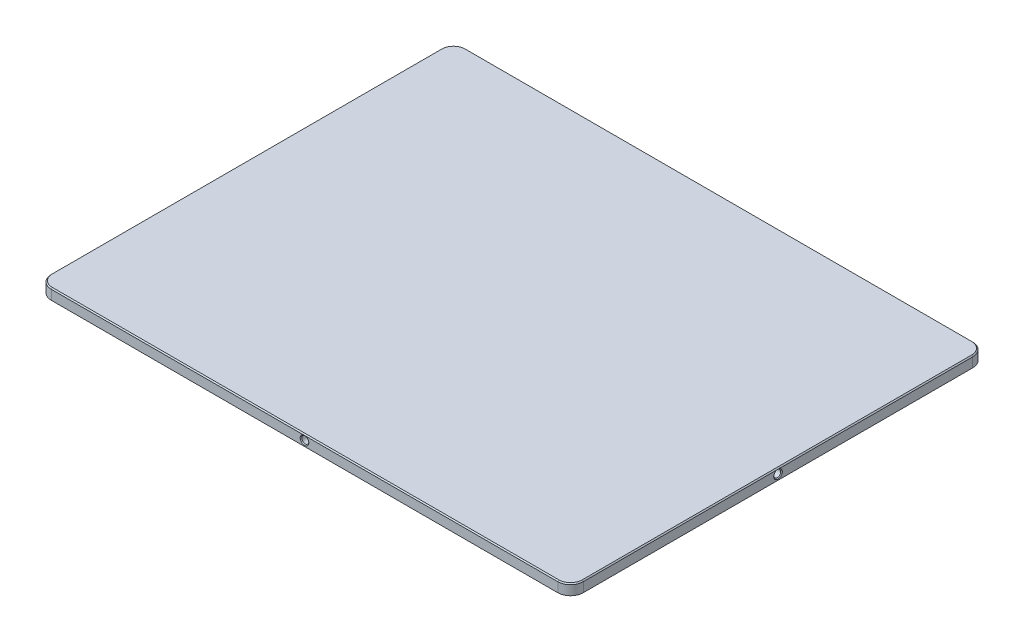
ISO-10303-21;
HEADER;
FILE_DESCRIPTION(('STEP AP214'),'2;1');
FILE_NAME('part.step','',(''),(''),'','','');
FILE_SCHEMA(('AUTOMOTIVE_DESIGN { 1 0 10303 214 1 1 1 1 }'));
ENDSEC;
DATA;
#1=APPLICATION_CONTEXT('core data for automotive mechanical design processes');
#2=APPLICATION_PROTOCOL_DEFINITION('international standard','automotive_design',2000,#1);
#3=PRODUCT_CONTEXT('',#1,'mechanical');
#4=PRODUCT('Part','Part','',(#3));
#5=PRODUCT_RELATED_PRODUCT_CATEGORY('part','',(#4));
#6=PRODUCT_DEFINITION_FORMATION('','',#4);
#7=PRODUCT_DEFINITION_CONTEXT('part definition',#1,'design');
#8=PRODUCT_DEFINITION('design','',#6,#7);
#9=PRODUCT_DEFINITION_SHAPE('','',#8);
#10=(LENGTH_UNIT() NAMED_UNIT(*) SI_UNIT(.MILLI.,.METRE.));
#11=(NAMED_UNIT(*) PLANE_ANGLE_UNIT() SI_UNIT($,.RADIAN.));
#12=(NAMED_UNIT(*) SI_UNIT($,.STERADIAN.) SOLID_ANGLE_UNIT());
#13=UNCERTAINTY_MEASURE_WITH_UNIT(LENGTH_MEASURE(1.E-05),#10,'distance_accuracy_value','');
#14=(GEOMETRIC_REPRESENTATION_CONTEXT(3) GLOBAL_UNCERTAINTY_ASSIGNED_CONTEXT((#13)) GLOBAL_UNIT_ASSIGNED_CONTEXT((#10,
#11,#12)) REPRESENTATION_CONTEXT('',''));
#15=CARTESIAN_POINT('',(0.,0.,0.));
#16=DIRECTION('',(0.,0.,1.));
#17=DIRECTION('',(1.,0.,0.));
#18=AXIS2_PLACEMENT_3D('',#15,#16,#17);
#19=CARTESIAN_POINT('',(125.,5.,-97.5));
#20=DIRECTION('',(-1.,0.,0.));
#21=DIRECTION('',(0.,0.,1.));
#22=AXIS2_PLACEMENT_3D('',#19,#20,#21);
#23=PLANE('',#22);
#24=DIRECTION('',(0.,-1.,0.));
#25=VECTOR('',#24,1.);
#26=CARTESIAN_POINT('',(125.,5.,-91.5));
#27=LINE('',#26,#25);
#28=CARTESIAN_POINT('',(125.,0.,-91.5));
#29=VERTEX_POINT('',#28);
#30=CARTESIAN_POINT('',(125.,4.5,-91.5));
#31=VERTEX_POINT('',#30);
#32=EDGE_CURVE('E214',#29,#31,#27,.F.);
#33=ORIENTED_EDGE('',*,*,#32,.T.);
#34=DIRECTION('',(0.,0.,1.));
#35=VECTOR('',#34,1.);
#36=CARTESIAN_POINT('',(125.,4.5,91.5));
#37=LINE('',#36,#35);
#38=CARTESIAN_POINT('',(125.,4.5,-0.317214438511259));
#39=VERTEX_POINT('',#38);
#40=EDGE_CURVE('E248',#31,#39,#37,.T.);
#41=ORIENTED_EDGE('',*,*,#40,.T.);
#42=CARTESIAN_POINT('',(125.,2.5,0.));
#43=DIRECTION('',(1.,0.,0.));
#44=DIRECTION('',(0.,0.,-1.));
#45=AXIS2_PLACEMENT_3D('',#42,#43,#44);
#46=CIRCLE('',#45,2.025);
#47=CARTESIAN_POINT('',(125.,4.5,0.317214438511259));
#48=VERTEX_POINT('',#47);
#49=EDGE_CURVE('E178',#48,#39,#46,.T.);
#50=ORIENTED_EDGE('',*,*,#49,.F.);
#51=DIRECTION('',(0.,0.,1.));
#52=VECTOR('',#51,1.);
#53=CARTESIAN_POINT('',(125.,4.5,91.5));
#54=LINE('',#53,#52);
#55=CARTESIAN_POINT('',(125.,4.5,91.5));
#56=VERTEX_POINT('',#55);
#57=EDGE_CURVE('E246',#48,#56,#54,.T.);
#58=ORIENTED_EDGE('',*,*,#57,.T.);
#59=DIRECTION('',(0.,-1.,0.));
#60=VECTOR('',#59,1.);
#61=CARTESIAN_POINT('',(125.,5.,91.5));
#62=LINE('',#61,#60);
#63=CARTESIAN_POINT('',(125.,0.,91.5));
#64=VERTEX_POINT('',#63);
#65=EDGE_CURVE('E212',#56,#64,#62,.T.);
#66=ORIENTED_EDGE('',*,*,#65,.T.);
#67=DIRECTION('',(0.,0.,-1.));
#68=VECTOR('',#67,1.);
#69=CARTESIAN_POINT('',(125.,0.,-97.5));
#70=LINE('',#69,#68);
#71=EDGE_CURVE('E187',#64,#29,#70,.T.);
#72=ORIENTED_EDGE('',*,*,#71,.T.);
#73=EDGE_LOOP('',(#33,#41,#50,#58,#66,#72));
#74=FACE_BOUND('',#73,.T.);
#75=ADVANCED_FACE('F38',(#74),#23,.F.);
#76=CARTESIAN_POINT('',(-125.,5.,-97.5));
#77=DIRECTION('',(0.,0.,1.));
#78=DIRECTION('',(1.,0.,0.));
#79=AXIS2_PLACEMENT_3D('',#76,#77,#78);
#80=PLANE('',#79);
#81=DIRECTION('',(0.,-1.,0.));
#82=VECTOR('',#81,1.);
#83=CARTESIAN_POINT('',(-119.,5.,-97.5));
#84=LINE('',#83,#82);
#85=CARTESIAN_POINT('',(-119.,0.,-97.5));
#86=VERTEX_POINT('',#85);
#87=CARTESIAN_POINT('',(-119.,4.5,-97.5));
#88=VERTEX_POINT('',#87);
#89=EDGE_CURVE('E199',#86,#88,#84,.F.);
#90=ORIENTED_EDGE('',*,*,#89,.T.);
#91=DIRECTION('',(1.,0.,0.));
#92=VECTOR('',#91,1.);
#93=CARTESIAN_POINT('',(119.,4.5,-97.5));
#94=LINE('',#93,#92);
#95=CARTESIAN_POINT('',(119.,4.5,-97.5));
#96=VERTEX_POINT('',#95);
#97=EDGE_CURVE('E356',#88,#96,#94,.T.);
#98=ORIENTED_EDGE('',*,*,#97,.T.);
#99=DIRECTION('',(0.,-1.,0.));
#100=VECTOR('',#99,1.);
#101=CARTESIAN_POINT('',(119.,5.,-97.5));
#102=LINE('',#101,#100);
#103=CARTESIAN_POINT('',(119.,0.,-97.5));
#104=VERTEX_POINT('',#103);
#105=EDGE_CURVE('E202',#96,#104,#102,.T.);
#106=ORIENTED_EDGE('',*,*,#105,.T.);
#107=DIRECTION('',(-1.,0.,0.));
#108=VECTOR('',#107,1.);
#109=CARTESIAN_POINT('',(-125.,0.,-97.5));
#110=LINE('',#109,#108);
#111=EDGE_CURVE('E190',#104,#86,#110,.T.);
#112=ORIENTED_EDGE('',*,*,#111,.T.);
#113=EDGE_LOOP('',(#90,#98,#106,#112));
#114=FACE_BOUND('',#113,.T.);
#115=ADVANCED_FACE('F294',(#114),#80,.F.);
#116=CARTESIAN_POINT('',(-125.,5.,-97.5));
#117=DIRECTION('',(1.,0.,0.));
#118=DIRECTION('',(0.,0.,-1.));
#119=AXIS2_PLACEMENT_3D('',#116,#117,#118);
#120=PLANE('',#119);
#121=DIRECTION('',(0.,-1.,0.));
#122=VECTOR('',#121,1.);
#123=CARTESIAN_POINT('',(-125.,5.,91.5));
#124=LINE('',#123,#122);
#125=CARTESIAN_POINT('',(-125.,0.,91.5));
#126=VERTEX_POINT('',#125);
#127=CARTESIAN_POINT('',(-125.,4.5,91.5));
#128=VERTEX_POINT('',#127);
#129=EDGE_CURVE('E217',#126,#128,#124,.F.);
#130=ORIENTED_EDGE('',*,*,#129,.T.);
#131=DIRECTION('',(0.,0.,-1.));
#132=VECTOR('',#131,1.);
#133=CARTESIAN_POINT('',(-125.,4.5,-91.5));
#134=LINE('',#133,#132);
#135=CARTESIAN_POINT('',(-125.,4.5,0.317214438511239));
#136=VERTEX_POINT('',#135);
#137=EDGE_CURVE('E363',#128,#136,#134,.T.);
#138=ORIENTED_EDGE('',*,*,#137,.T.);
#139=CARTESIAN_POINT('',(-125.,2.49999999999999,0.));
#140=DIRECTION('',(-1.,0.,0.));
#141=DIRECTION('',(0.,0.,1.));
#142=AXIS2_PLACEMENT_3D('',#139,#140,#141);
#143=CIRCLE('',#142,2.025);
#144=CARTESIAN_POINT('',(-125.,4.5,-0.317214438511169));
#145=VERTEX_POINT('',#144);
#146=EDGE_CURVE('E162',#145,#136,#143,.T.);
#147=ORIENTED_EDGE('',*,*,#146,.F.);
#148=DIRECTION('',(0.,0.,-1.));
#149=VECTOR('',#148,1.);
#150=CARTESIAN_POINT('',(-125.,4.5,-91.5));
#151=LINE('',#150,#149);
#152=CARTESIAN_POINT('',(-125.,4.5,-91.5));
#153=VERTEX_POINT('',#152);
#154=EDGE_CURVE('E359',#145,#153,#151,.T.);
#155=ORIENTED_EDGE('',*,*,#154,.T.);
#156=DIRECTION('',(0.,-1.,0.));
#157=VECTOR('',#156,1.);
#158=CARTESIAN_POINT('',(-125.,5.,-91.5));
#159=LINE('',#158,#157);
#160=CARTESIAN_POINT('',(-125.,0.,-91.5));
#161=VERTEX_POINT('',#160);
#162=EDGE_CURVE('E220',#153,#161,#159,.T.);
#163=ORIENTED_EDGE('',*,*,#162,.T.);
#164=DIRECTION('',(0.,0.,1.));
#165=VECTOR('',#164,1.);
#166=CARTESIAN_POINT('',(-125.,0.,-97.5));
#167=LINE('',#166,#165);
#168=EDGE_CURVE('E193',#161,#126,#167,.T.);
#169=ORIENTED_EDGE('',*,*,#168,.T.);
#170=EDGE_LOOP('',(#130,#138,#147,#155,#163,#169));
#171=FACE_BOUND('',#170,.T.);
#172=ADVANCED_FACE('F291',(#171),#120,.F.);
#173=CARTESIAN_POINT('',(-125.,5.,97.5));
#174=DIRECTION('',(0.,0.,-1.));
#175=DIRECTION('',(-1.,0.,0.));
#176=AXIS2_PLACEMENT_3D('',#173,#174,#175);
#177=PLANE('',#176);
#178=DIRECTION('',(0.,-1.,0.));
#179=VECTOR('',#178,1.);
#180=CARTESIAN_POINT('',(119.,5.,97.5));
#181=LINE('',#180,#179);
#182=CARTESIAN_POINT('',(119.,0.,97.5));
#183=VERTEX_POINT('',#182);
#184=CARTESIAN_POINT('',(119.,4.5,97.5));
#185=VERTEX_POINT('',#184);
#186=EDGE_CURVE('E224',#183,#185,#181,.F.);
#187=ORIENTED_EDGE('',*,*,#186,.T.);
#188=DIRECTION('',(-1.,0.,0.));
#189=VECTOR('',#188,1.);
#190=CARTESIAN_POINT('',(-119.,4.5,97.5));
#191=LINE('',#190,#189);
#192=CARTESIAN_POINT('',(0.31721443851128,4.5,97.5));
#193=VERTEX_POINT('',#192);
#194=EDGE_CURVE('E47',#185,#193,#191,.T.);
#195=ORIENTED_EDGE('',*,*,#194,.T.);
#196=CARTESIAN_POINT('',(0.,2.5,97.5));
#197=DIRECTION('',(0.,0.,1.));
#198=DIRECTION('',(1.,0.,0.));
#199=AXIS2_PLACEMENT_3D('',#196,#197,#198);
#200=CIRCLE('',#199,2.025);
#201=CARTESIAN_POINT('',(-0.31721443851128,4.5,97.5));
#202=VERTEX_POINT('',#201);
#203=EDGE_CURVE('E169',#202,#193,#200,.T.);
#204=ORIENTED_EDGE('',*,*,#203,.F.);
#205=DIRECTION('',(-1.,0.,0.));
#206=VECTOR('',#205,1.);
#207=CARTESIAN_POINT('',(-119.,4.5,97.5));
#208=LINE('',#207,#206);
#209=CARTESIAN_POINT('',(-119.,4.5,97.5));
#210=VERTEX_POINT('',#209);
#211=EDGE_CURVE('E337',#202,#210,#208,.T.);
#212=ORIENTED_EDGE('',*,*,#211,.T.);
#213=DIRECTION('',(0.,-1.,0.));
#214=VECTOR('',#213,1.);
#215=CARTESIAN_POINT('',(-119.,5.,97.5));
#216=LINE('',#215,#214);
#217=CARTESIAN_POINT('',(-119.,0.,97.5));
#218=VERTEX_POINT('',#217);
#219=EDGE_CURVE('E222',#210,#218,#216,.T.);
#220=ORIENTED_EDGE('',*,*,#219,.T.);
#221=DIRECTION('',(1.,0.,0.));
#222=VECTOR('',#221,1.);
#223=CARTESIAN_POINT('',(-125.,0.,97.5));
#224=LINE('',#223,#222);
#225=EDGE_CURVE('E196',#218,#183,#224,.T.);
#226=ORIENTED_EDGE('',*,*,#225,.T.);
#227=EDGE_LOOP('',(#187,#195,#204,#212,#220,#226));
#228=FACE_BOUND('',#227,.T.);
#229=ADVANCED_FACE('F284',(#228),#177,.F.);
#230=CARTESIAN_POINT('',(0.,5.,0.));
#231=DIRECTION('',(0.,1.,0.));
#232=DIRECTION('',(0.,0.,1.));
#233=AXIS2_PLACEMENT_3D('',#230,#231,#232);
#234=PLANE('',#233);
#235=DIRECTION('',(1.,0.,0.));
#236=VECTOR('',#235,1.);
#237=CARTESIAN_POINT('',(119.,5.,97.));
#238=LINE('',#237,#236);
#239=CARTESIAN_POINT('',(-119.,5.,97.));
#240=VERTEX_POINT('',#239);
#241=CARTESIAN_POINT('',(119.,5.,97.));
#242=VERTEX_POINT('',#241);
#243=EDGE_CURVE('E226',#240,#242,#238,.T.);
#244=ORIENTED_EDGE('',*,*,#243,.T.);
#245=CARTESIAN_POINT('',(119.,5.,91.5));
#246=DIRECTION('',(0.,1.,0.));
#247=DIRECTION('',(0.,0.,1.));
#248=AXIS2_PLACEMENT_3D('',#245,#246,#247);
#249=CIRCLE('',#248,5.49999999999999);
#250=CARTESIAN_POINT('',(124.5,5.,91.5));
#251=VERTEX_POINT('',#250);
#252=EDGE_CURVE('E240',#242,#251,#249,.T.);
#253=ORIENTED_EDGE('',*,*,#252,.T.);
#254=DIRECTION('',(0.,0.,-1.));
#255=VECTOR('',#254,1.);
#256=CARTESIAN_POINT('',(124.5,5.,-91.5));
#257=LINE('',#256,#255);
#258=CARTESIAN_POINT('',(124.5,5.,-91.5));
#259=VERTEX_POINT('',#258);
#260=EDGE_CURVE('E238',#251,#259,#257,.T.);
#261=ORIENTED_EDGE('',*,*,#260,.T.);
#262=CARTESIAN_POINT('',(119.,5.,-91.5));
#263=DIRECTION('',(0.,1.,0.));
#264=DIRECTION('',(0.,0.,1.));
#265=AXIS2_PLACEMENT_3D('',#262,#263,#264);
#266=CIRCLE('',#265,5.49999999999999);
#267=CARTESIAN_POINT('',(119.,5.,-97.));
#268=VERTEX_POINT('',#267);
#269=EDGE_CURVE('E236',#259,#268,#266,.T.);
#270=ORIENTED_EDGE('',*,*,#269,.T.);
#271=DIRECTION('',(-1.,0.,0.));
#272=VECTOR('',#271,1.);
#273=CARTESIAN_POINT('',(-119.,5.,-97.));
#274=LINE('',#273,#272);
#275=CARTESIAN_POINT('',(-119.,5.,-97.));
#276=VERTEX_POINT('',#275);
#277=EDGE_CURVE('E234',#268,#276,#274,.T.);
#278=ORIENTED_EDGE('',*,*,#277,.T.);
#279=CARTESIAN_POINT('',(-119.,5.,-91.5));
#280=DIRECTION('',(0.,1.,0.));
#281=DIRECTION('',(0.,0.,1.));
#282=AXIS2_PLACEMENT_3D('',#279,#280,#281);
#283=CIRCLE('',#282,5.49999999999999);
#284=CARTESIAN_POINT('',(-124.5,5.,-91.5));
#285=VERTEX_POINT('',#284);
#286=EDGE_CURVE('E232',#276,#285,#283,.T.);
#287=ORIENTED_EDGE('',*,*,#286,.T.);
#288=DIRECTION('',(0.,0.,1.));
#289=VECTOR('',#288,1.);
#290=CARTESIAN_POINT('',(-124.5,5.,91.5));
#291=LINE('',#290,#289);
#292=CARTESIAN_POINT('',(-124.5,5.,91.5));
#293=VERTEX_POINT('',#292);
#294=EDGE_CURVE('E230',#285,#293,#291,.T.);
#295=ORIENTED_EDGE('',*,*,#294,.T.);
#296=CARTESIAN_POINT('',(-119.,5.,91.5));
#297=DIRECTION('',(0.,1.,0.));
#298=DIRECTION('',(0.,0.,1.));
#299=AXIS2_PLACEMENT_3D('',#296,#297,#298);
#300=CIRCLE('',#299,5.49999999999999);
#301=EDGE_CURVE('E228',#293,#240,#300,.T.);
#302=ORIENTED_EDGE('',*,*,#301,.T.);
#303=EDGE_LOOP('',(#244,#253,#261,#270,#278,#287,#295,#302));
#304=FACE_BOUND('',#303,.T.);
#305=ADVANCED_FACE('F281',(#304),#234,.T.);
#306=CARTESIAN_POINT('',(0.,0.,0.));
#307=DIRECTION('',(0.,1.,0.));
#308=DIRECTION('',(0.,0.,1.));
#309=AXIS2_PLACEMENT_3D('',#306,#307,#308);
#310=PLANE('',#309);
#311=ORIENTED_EDGE('',*,*,#111,.F.);
#312=CARTESIAN_POINT('',(119.,0.,-91.5));
#313=DIRECTION('',(0.,1.,0.));
#314=DIRECTION('',(0.,0.,1.));
#315=AXIS2_PLACEMENT_3D('',#312,#313,#314);
#316=CIRCLE('',#315,6.);
#317=EDGE_CURVE('E210',#104,#29,#316,.F.);
#318=ORIENTED_EDGE('',*,*,#317,.T.);
#319=ORIENTED_EDGE('',*,*,#71,.F.);
#320=CARTESIAN_POINT('',(119.,0.,91.5));
#321=DIRECTION('',(0.,1.,0.));
#322=DIRECTION('',(0.,0.,1.));
#323=AXIS2_PLACEMENT_3D('',#320,#321,#322);
#324=CIRCLE('',#323,6.);
#325=EDGE_CURVE('E206',#64,#183,#324,.F.);
#326=ORIENTED_EDGE('',*,*,#325,.T.);
#327=ORIENTED_EDGE('',*,*,#225,.F.);
#328=CARTESIAN_POINT('',(-119.,0.,91.5));
#329=DIRECTION('',(0.,1.,0.));
#330=DIRECTION('',(0.,0.,1.));
#331=AXIS2_PLACEMENT_3D('',#328,#329,#330);
#332=CIRCLE('',#331,6.);
#333=EDGE_CURVE('E204',#218,#126,#332,.F.);
#334=ORIENTED_EDGE('',*,*,#333,.T.);
#335=ORIENTED_EDGE('',*,*,#168,.F.);
#336=CARTESIAN_POINT('',(-119.,0.,-91.5));
#337=DIRECTION('',(0.,1.,0.));
#338=DIRECTION('',(0.,0.,1.));
#339=AXIS2_PLACEMENT_3D('',#336,#337,#338);
#340=CIRCLE('',#339,6.);
#341=EDGE_CURVE('E208',#161,#86,#340,.F.);
#342=ORIENTED_EDGE('',*,*,#341,.T.);
#343=EDGE_LOOP('',(#311,#318,#319,#326,#327,#334,#335,#342));
#344=FACE_BOUND('',#343,.T.);
#345=ADVANCED_FACE('F279',(#344),#310,.F.);
#346=CARTESIAN_POINT('',(85.,2.5,0.));
#347=DIRECTION('',(1.,0.,0.));
#348=DIRECTION('',(0.,0.,-1.));
#349=AXIS2_PLACEMENT_3D('',#346,#347,#348);
#350=CONICAL_SURFACE('',#349,1.64999999999999,1.02974425867665);
#351=CARTESIAN_POINT('',(84.0085799786045,2.49999999999999,0.));
#352=VERTEX_POINT('',#351);
#353=VERTEX_LOOP('',#352);
#354=FACE_BOUND('',#353,.T.);
#355=CARTESIAN_POINT('',(85.,2.5,0.));
#356=DIRECTION('',(1.,0.,0.));
#357=DIRECTION('',(0.,0.,-1.));
#358=AXIS2_PLACEMENT_3D('',#355,#356,#357);
#359=CIRCLE('',#358,1.64999999999999);
#360=CARTESIAN_POINT('',(85.,2.5,-1.64999999999999));
#361=VERTEX_POINT('',#360);
#362=EDGE_CURVE('E184',#361,#361,#359,.T.);
#363=ORIENTED_EDGE('',*,*,#362,.T.);
#364=EDGE_LOOP('',(#363));
#365=FACE_BOUND('',#364,.T.);
#366=ADVANCED_FACE('F275',(#354,#365),#350,.F.);
#367=CARTESIAN_POINT('',(125.,2.5,0.));
#368=DIRECTION('',(1.,0.,0.));
#369=DIRECTION('',(0.,0.,-1.));
#370=AXIS2_PLACEMENT_3D('',#367,#368,#369);
#371=CYLINDRICAL_SURFACE('',#370,1.64999999999999);
#372=ORIENTED_EDGE('',*,*,#362,.F.);
#373=EDGE_LOOP('',(#372));
#374=FACE_BOUND('',#373,.T.);
#375=CARTESIAN_POINT('',(124.625,2.5,0.));
#376=DIRECTION('',(1.,0.,0.));
#377=DIRECTION('',(0.,0.,-1.));
#378=AXIS2_PLACEMENT_3D('',#375,#376,#377);
#379=CIRCLE('',#378,1.65);
#380=CARTESIAN_POINT('',(124.625,2.5,-1.65));
#381=VERTEX_POINT('',#380);
#382=EDGE_CURVE('E181',#381,#381,#379,.T.);
#383=ORIENTED_EDGE('',*,*,#382,.T.);
#384=EDGE_LOOP('',(#383));
#385=FACE_BOUND('',#384,.T.);
#386=ADVANCED_FACE('F270',(#374,#385),#371,.F.);
#387=CARTESIAN_POINT('',(125.,2.5,0.));
#388=DIRECTION('',(1.,0.,0.));
#389=DIRECTION('',(0.,0.,-1.));
#390=AXIS2_PLACEMENT_3D('',#387,#388,#389);
#391=CONICAL_SURFACE('',#390,2.025,0.785398163397451);
#392=ORIENTED_EDGE('',*,*,#382,.F.);
#393=EDGE_LOOP('',(#392));
#394=FACE_BOUND('',#393,.T.);
#395=ORIENTED_EDGE('',*,*,#49,.T.);
#396=CARTESIAN_POINT('',(125.,4.5,-0.317214438511259));
#397=CARTESIAN_POINT('',(124.991666666667,4.50833333333333,-0.211476292340839));
#398=CARTESIAN_POINT('',(124.9875,4.5125,-0.105738146170419));
#399=CARTESIAN_POINT('',(124.9875,4.5125,0.10573814617042));
#400=CARTESIAN_POINT('',(124.991666666667,4.50833333333333,0.211476292340839));
#401=CARTESIAN_POINT('',(125.,4.5,0.317214438511259));
#402=B_SPLINE_CURVE_WITH_KNOTS('',3,(#396,#397,#398,#399,#400,#401),.UNSPECIFIED.,.F.,.F.,(4,2,
4),(0.,0.317706625678492,0.635413251356983),.UNSPECIFIED.);
#403=EDGE_CURVE('E250',#39,#48,#402,.T.);
#404=ORIENTED_EDGE('',*,*,#403,.T.);
#405=EDGE_LOOP('',(#395,#404));
#406=FACE_BOUND('',#405,.T.);
#407=ADVANCED_FACE('F264',(#394,#406),#391,.F.);
#408=CARTESIAN_POINT('',(-85.,2.49999999999999,0.));
#409=DIRECTION('',(-1.,0.,0.));
#410=DIRECTION('',(0.,0.,1.));
#411=AXIS2_PLACEMENT_3D('',#408,#409,#410);
#412=CONICAL_SURFACE('',#411,1.64999999999999,1.02974425867665);
#413=CARTESIAN_POINT('',(-84.0085799786045,2.49999999999998,0.));
#414=VERTEX_POINT('',#413);
#415=VERTEX_LOOP('',#414);
#416=FACE_BOUND('',#415,.T.);
#417=CARTESIAN_POINT('',(-85.,2.49999999999999,0.));
#418=DIRECTION('',(-1.,0.,0.));
#419=DIRECTION('',(0.,0.,1.));
#420=AXIS2_PLACEMENT_3D('',#417,#418,#419);
#421=CIRCLE('',#420,1.64999999999999);
#422=CARTESIAN_POINT('',(-85.,2.49999999999999,1.65000000000002));
#423=VERTEX_POINT('',#422);
#424=EDGE_CURVE('E175',#423,#423,#421,.T.);
#425=ORIENTED_EDGE('',*,*,#424,.T.);
#426=EDGE_LOOP('',(#425));
#427=FACE_BOUND('',#426,.T.);
#428=ADVANCED_FACE('F269',(#416,#427),#412,.F.);
#429=CARTESIAN_POINT('',(-125.,2.49999999999999,0.));
#430=DIRECTION('',(-1.,0.,0.));
#431=DIRECTION('',(0.,0.,1.));
#432=AXIS2_PLACEMENT_3D('',#429,#430,#431);
#433=CYLINDRICAL_SURFACE('',#432,1.64999999999999);
#434=ORIENTED_EDGE('',*,*,#424,.F.);
#435=EDGE_LOOP('',(#434));
#436=FACE_BOUND('',#435,.T.);
#437=CARTESIAN_POINT('',(-124.625,2.49999999999999,0.));
#438=DIRECTION('',(-1.,0.,0.));
#439=DIRECTION('',(0.,0.,1.));
#440=AXIS2_PLACEMENT_3D('',#437,#438,#439);
#441=CIRCLE('',#440,1.65);
#442=CARTESIAN_POINT('',(-124.625,2.49999999999999,1.65000000000003));
#443=VERTEX_POINT('',#442);
#444=EDGE_CURVE('E166',#443,#443,#441,.T.);
#445=ORIENTED_EDGE('',*,*,#444,.T.);
#446=EDGE_LOOP('',(#445));
#447=FACE_BOUND('',#446,.T.);
#448=ADVANCED_FACE('F379',(#436,#447),#433,.F.);
#449=CARTESIAN_POINT('',(-125.,2.49999999999999,0.));
#450=DIRECTION('',(-1.,0.,0.));
#451=DIRECTION('',(0.,0.,1.));
#452=AXIS2_PLACEMENT_3D('',#449,#450,#451);
#453=CONICAL_SURFACE('',#452,2.025,0.785398163397453);
#454=ORIENTED_EDGE('',*,*,#444,.F.);
#455=EDGE_LOOP('',(#454));
#456=FACE_BOUND('',#455,.T.);
#457=ORIENTED_EDGE('',*,*,#146,.T.);
#458=CARTESIAN_POINT('',(-125.,4.5,0.317214438511239));
#459=CARTESIAN_POINT('',(-124.991666666667,4.50833333333333,0.211476292340837));
#460=CARTESIAN_POINT('',(-124.9875,4.51249999999999,0.105738146170436));
#461=CARTESIAN_POINT('',(-124.9875,4.51249999999999,-0.105738146170367));
#462=CARTESIAN_POINT('',(-124.991666666667,4.50833333333333,-0.211476292340768));
#463=CARTESIAN_POINT('',(-125.,4.5,-0.31721443851117));
#464=B_SPLINE_CURVE_WITH_KNOTS('',3,(#458,#459,#460,#461,#462,#463),.UNSPECIFIED.,.F.,.F.,(4,2,
4),(0.,0.317706625678437,0.635413251356874),.UNSPECIFIED.);
#465=EDGE_CURVE('E365',#136,#145,#464,.T.);
#466=ORIENTED_EDGE('',*,*,#465,.T.);
#467=EDGE_LOOP('',(#457,#466));
#468=FACE_BOUND('',#467,.T.);
#469=ADVANCED_FACE('F156',(#456,#468),#453,.F.);
#470=CARTESIAN_POINT('',(0.,2.5,57.5));
#471=DIRECTION('',(0.,0.,1.));
#472=DIRECTION('',(1.,0.,0.));
#473=AXIS2_PLACEMENT_3D('',#470,#471,#472);
#474=CONICAL_SURFACE('',#473,1.64999999999998,1.02974425867665);
#475=CARTESIAN_POINT('',(0.,2.5,56.5085799786045));
#476=VERTEX_POINT('',#475);
#477=VERTEX_LOOP('',#476);
#478=FACE_BOUND('',#477,.T.);
#479=CARTESIAN_POINT('',(0.,2.5,57.5));
#480=DIRECTION('',(0.,0.,1.));
#481=DIRECTION('',(1.,0.,0.));
#482=AXIS2_PLACEMENT_3D('',#479,#480,#481);
#483=CIRCLE('',#482,1.64999999999998);
#484=CARTESIAN_POINT('',(1.64999999999998,2.5,57.5));
#485=VERTEX_POINT('',#484);
#486=EDGE_CURVE('E160',#485,#485,#483,.T.);
#487=ORIENTED_EDGE('',*,*,#486,.T.);
#488=EDGE_LOOP('',(#487));
#489=FACE_BOUND('',#488,.T.);
#490=ADVANCED_FACE('F152',(#478,#489),#474,.F.);
#491=CARTESIAN_POINT('',(0.,2.5,97.5));
#492=DIRECTION('',(0.,0.,1.));
#493=DIRECTION('',(1.,0.,0.));
#494=AXIS2_PLACEMENT_3D('',#491,#492,#493);
#495=CYLINDRICAL_SURFACE('',#494,1.64999999999999);
#496=ORIENTED_EDGE('',*,*,#486,.F.);
#497=EDGE_LOOP('',(#496));
#498=FACE_BOUND('',#497,.T.);
#499=CARTESIAN_POINT('',(0.,2.5,97.125));
#500=DIRECTION('',(0.,0.,1.));
#501=DIRECTION('',(1.,0.,0.));
#502=AXIS2_PLACEMENT_3D('',#499,#500,#501);
#503=CIRCLE('',#502,1.64999999999999);
#504=CARTESIAN_POINT('',(1.64999999999999,2.5,97.125));
#505=VERTEX_POINT('',#504);
#506=EDGE_CURVE('E163',#505,#505,#503,.T.);
#507=ORIENTED_EDGE('',*,*,#506,.T.);
#508=EDGE_LOOP('',(#507));
#509=FACE_BOUND('',#508,.T.);
#510=ADVANCED_FACE('F155',(#498,#509),#495,.F.);
#511=CARTESIAN_POINT('',(0.,2.5,97.5));
#512=DIRECTION('',(0.,0.,1.));
#513=DIRECTION('',(1.,0.,0.));
#514=AXIS2_PLACEMENT_3D('',#511,#512,#513);
#515=CONICAL_SURFACE('',#514,2.025,0.785398163397453);
#516=ORIENTED_EDGE('',*,*,#506,.F.);
#517=EDGE_LOOP('',(#516));
#518=FACE_BOUND('',#517,.T.);
#519=ORIENTED_EDGE('',*,*,#203,.T.);
#520=CARTESIAN_POINT('',(0.31721443851128,4.5,97.5));
#521=CARTESIAN_POINT('',(0.211476292340853,4.50833333333333,97.4916666666667));
#522=CARTESIAN_POINT('',(0.105738146170426,4.5125,97.4875));
#523=CARTESIAN_POINT('',(-0.105738146170427,4.5125,97.4875));
#524=CARTESIAN_POINT('',(-0.211476292340854,4.50833333333333,97.4916666666667));
#525=CARTESIAN_POINT('',(-0.317214438511281,4.5,97.5));
#526=B_SPLINE_CURVE_WITH_KNOTS('',3,(#520,#521,#522,#523,#524,#525),.UNSPECIFIED.,.F.,.F.,(4,2,
4),(0.,0.317706625678513,0.635413251357027),.UNSPECIFIED.);
#527=EDGE_CURVE('E11',#193,#202,#526,.T.);
#528=ORIENTED_EDGE('',*,*,#527,.T.);
#529=EDGE_LOOP('',(#519,#528));
#530=FACE_BOUND('',#529,.T.);
#531=ADVANCED_FACE('F306',(#518,#530),#515,.F.);
#532=CARTESIAN_POINT('',(119.,5.,-91.5));
#533=DIRECTION('',(0.,-1.,0.));
#534=DIRECTION('',(0.,0.,-1.));
#535=AXIS2_PLACEMENT_3D('',#532,#533,#534);
#536=CYLINDRICAL_SURFACE('',#535,6.);
#537=ORIENTED_EDGE('',*,*,#105,.F.);
#538=CARTESIAN_POINT('',(119.,4.5,-91.5));
#539=DIRECTION('',(0.,1.,0.));
#540=DIRECTION('',(0.,0.,1.));
#541=AXIS2_PLACEMENT_3D('',#538,#539,#540);
#542=CIRCLE('',#541,6.);
#543=EDGE_CURVE('E258',#96,#31,#542,.F.);
#544=ORIENTED_EDGE('',*,*,#543,.T.);
#545=ORIENTED_EDGE('',*,*,#32,.F.);
#546=ORIENTED_EDGE('',*,*,#317,.F.);
#547=EDGE_LOOP('',(#537,#544,#545,#546));
#548=FACE_BOUND('',#547,.T.);
#549=ADVANCED_FACE('F302',(#548),#536,.T.);
#550=CARTESIAN_POINT('',(-119.,5.,-91.5));
#551=DIRECTION('',(0.,-1.,0.));
#552=DIRECTION('',(0.,0.,-1.));
#553=AXIS2_PLACEMENT_3D('',#550,#551,#552);
#554=CYLINDRICAL_SURFACE('',#553,6.);
#555=ORIENTED_EDGE('',*,*,#162,.F.);
#556=CARTESIAN_POINT('',(-119.,4.5,-91.5));
#557=DIRECTION('',(0.,1.,0.));
#558=DIRECTION('',(0.,0.,1.));
#559=AXIS2_PLACEMENT_3D('',#556,#557,#558);
#560=CIRCLE('',#559,6.);
#561=EDGE_CURVE('E357',#153,#88,#560,.F.);
#562=ORIENTED_EDGE('',*,*,#561,.T.);
#563=ORIENTED_EDGE('',*,*,#89,.F.);
#564=ORIENTED_EDGE('',*,*,#341,.F.);
#565=EDGE_LOOP('',(#555,#562,#563,#564));
#566=FACE_BOUND('',#565,.T.);
#567=ADVANCED_FACE('F305',(#566),#554,.T.);
#568=CARTESIAN_POINT('',(119.,5.,91.5));
#569=DIRECTION('',(0.,-1.,0.));
#570=DIRECTION('',(0.,0.,-1.));
#571=AXIS2_PLACEMENT_3D('',#568,#569,#570);
#572=CYLINDRICAL_SURFACE('',#571,6.);
#573=ORIENTED_EDGE('',*,*,#65,.F.);
#574=CARTESIAN_POINT('',(119.,4.5,91.5));
#575=DIRECTION('',(0.,1.,0.));
#576=DIRECTION('',(0.,0.,1.));
#577=AXIS2_PLACEMENT_3D('',#574,#575,#576);
#578=CIRCLE('',#577,6.);
#579=EDGE_CURVE('E243',#56,#185,#578,.F.);
#580=ORIENTED_EDGE('',*,*,#579,.T.);
#581=ORIENTED_EDGE('',*,*,#186,.F.);
#582=ORIENTED_EDGE('',*,*,#325,.F.);
#583=EDGE_LOOP('',(#573,#580,#581,#582));
#584=FACE_BOUND('',#583,.T.);
#585=ADVANCED_FACE('F310',(#584),#572,.T.);
#586=CARTESIAN_POINT('',(-119.,5.,91.5));
#587=DIRECTION('',(0.,-1.,0.));
#588=DIRECTION('',(0.,0.,-1.));
#589=AXIS2_PLACEMENT_3D('',#586,#587,#588);
#590=CYLINDRICAL_SURFACE('',#589,6.);
#591=ORIENTED_EDGE('',*,*,#219,.F.);
#592=CARTESIAN_POINT('',(-119.,4.5,91.5));
#593=DIRECTION('',(0.,1.,0.));
#594=DIRECTION('',(0.,0.,1.));
#595=AXIS2_PLACEMENT_3D('',#592,#593,#594);
#596=CIRCLE('',#595,6.);
#597=EDGE_CURVE('E372',#210,#128,#596,.F.);
#598=ORIENTED_EDGE('',*,*,#597,.T.);
#599=ORIENTED_EDGE('',*,*,#129,.F.);
#600=ORIENTED_EDGE('',*,*,#333,.F.);
#601=EDGE_LOOP('',(#591,#598,#599,#600));
#602=FACE_BOUND('',#601,.T.);
#603=ADVANCED_FACE('F314',(#602),#590,.T.);
#604=CARTESIAN_POINT('',(-119.,5.,-91.5));
#605=DIRECTION('',(0.,-1.,0.));
#606=DIRECTION('',(0.,0.,-1.));
#607=AXIS2_PLACEMENT_3D('',#604,#605,#606);
#608=CONICAL_SURFACE('',#607,5.49999999999999,0.785398163397453);
#609=DIRECTION('',(0.,0.70710678118654,0.707106781186555));
#610=VECTOR('',#609,1.);
#611=CARTESIAN_POINT('',(-119.,4.5,-97.5));
#612=LINE('',#611,#610);
#613=EDGE_CURVE('E410',#88,#276,#612,.T.);
#614=ORIENTED_EDGE('',*,*,#613,.F.);
#615=ORIENTED_EDGE('',*,*,#561,.F.);
#616=DIRECTION('',(-0.707106781186555,-0.70710678118654,0.));
#617=VECTOR('',#616,1.);
#618=CARTESIAN_POINT('',(-124.5,5.,-91.5));
#619=LINE('',#618,#617);
#620=EDGE_CURVE('E42',#285,#153,#619,.T.);
#621=ORIENTED_EDGE('',*,*,#620,.F.);
#622=ORIENTED_EDGE('',*,*,#286,.F.);
#623=EDGE_LOOP('',(#614,#615,#621,#622));
#624=FACE_BOUND('',#623,.T.);
#625=ADVANCED_FACE('F40',(#624),#608,.T.);
#626=CARTESIAN_POINT('',(-124.5,5.,0.));
#627=DIRECTION('',(-0.70710678118654,0.707106781186555,0.));
#628=DIRECTION('',(0.,0.,-1.));
#629=AXIS2_PLACEMENT_3D('',#626,#627,#628);
#630=PLANE('',#629);
#631=ORIENTED_EDGE('',*,*,#465,.F.);
#632=ORIENTED_EDGE('',*,*,#137,.F.);
#633=DIRECTION('',(-0.707106781186555,-0.70710678118654,0.));
#634=VECTOR('',#633,1.);
#635=CARTESIAN_POINT('',(-124.5,5.,91.5));
#636=LINE('',#635,#634);
#637=EDGE_CURVE('E413',#293,#128,#636,.T.);
#638=ORIENTED_EDGE('',*,*,#637,.F.);
#639=ORIENTED_EDGE('',*,*,#294,.F.);
#640=ORIENTED_EDGE('',*,*,#620,.T.);
#641=ORIENTED_EDGE('',*,*,#154,.F.);
#642=EDGE_LOOP('',(#631,#632,#638,#639,#640,#641));
#643=FACE_BOUND('',#642,.T.);
#644=ADVANCED_FACE('F374',(#643),#630,.T.);
#645=CARTESIAN_POINT('',(0.,5.,-97.));
#646=DIRECTION('',(0.,0.707106781186555,-0.70710678118654));
#647=DIRECTION('',(1.,0.,0.));
#648=AXIS2_PLACEMENT_3D('',#645,#646,#647);
#649=PLANE('',#648);
#650=ORIENTED_EDGE('',*,*,#613,.T.);
#651=ORIENTED_EDGE('',*,*,#277,.F.);
#652=DIRECTION('',(0.,0.70710678118654,0.707106781186555));
#653=VECTOR('',#652,1.);
#654=CARTESIAN_POINT('',(119.,4.5,-97.5));
#655=LINE('',#654,#653);
#656=EDGE_CURVE('E415',#96,#268,#655,.T.);
#657=ORIENTED_EDGE('',*,*,#656,.F.);
#658=ORIENTED_EDGE('',*,*,#97,.F.);
#659=EDGE_LOOP('',(#650,#651,#657,#658));
#660=FACE_BOUND('',#659,.T.);
#661=ADVANCED_FACE('F414',(#660),#649,.T.);
#662=CARTESIAN_POINT('',(-119.,5.,91.5));
#663=DIRECTION('',(0.,-1.,0.));
#664=DIRECTION('',(0.,0.,-1.));
#665=AXIS2_PLACEMENT_3D('',#662,#663,#664);
#666=CONICAL_SURFACE('',#665,5.49999999999999,0.785398163397453);
#667=ORIENTED_EDGE('',*,*,#637,.T.);
#668=ORIENTED_EDGE('',*,*,#597,.F.);
#669=DIRECTION('',(0.,-0.70710678118654,0.707106781186555));
#670=VECTOR('',#669,1.);
#671=CARTESIAN_POINT('',(-119.,5.,97.));
#672=LINE('',#671,#670);
#673=EDGE_CURVE('E417',#240,#210,#672,.T.);
#674=ORIENTED_EDGE('',*,*,#673,.F.);
#675=ORIENTED_EDGE('',*,*,#301,.F.);
#676=EDGE_LOOP('',(#667,#668,#674,#675));
#677=FACE_BOUND('',#676,.T.);
#678=ADVANCED_FACE('F444',(#677),#666,.T.);
#679=CARTESIAN_POINT('',(119.,5.,-91.5));
#680=DIRECTION('',(0.,-1.,0.));
#681=DIRECTION('',(0.,0.,-1.));
#682=AXIS2_PLACEMENT_3D('',#679,#680,#681);
#683=CONICAL_SURFACE('',#682,5.49999999999999,0.785398163397453);
#684=ORIENTED_EDGE('',*,*,#656,.T.);
#685=ORIENTED_EDGE('',*,*,#269,.F.);
#686=DIRECTION('',(-0.707106781186555,0.70710678118654,0.));
#687=VECTOR('',#686,1.);
#688=CARTESIAN_POINT('',(125.,4.5,-91.5));
#689=LINE('',#688,#687);
#690=EDGE_CURVE('E333',#31,#259,#689,.T.);
#691=ORIENTED_EDGE('',*,*,#690,.F.);
#692=ORIENTED_EDGE('',*,*,#543,.F.);
#693=EDGE_LOOP('',(#684,#685,#691,#692));
#694=FACE_BOUND('',#693,.T.);
#695=ADVANCED_FACE('F447',(#694),#683,.T.);
#696=CARTESIAN_POINT('',(0.,5.,97.));
#697=DIRECTION('',(0.,0.707106781186555,0.70710678118654));
#698=DIRECTION('',(-1.,0.,0.));
#699=AXIS2_PLACEMENT_3D('',#696,#697,#698);
#700=PLANE('',#699);
#701=ORIENTED_EDGE('',*,*,#527,.F.);
#702=ORIENTED_EDGE('',*,*,#194,.F.);
#703=DIRECTION('',(0.,-0.70710678118654,0.707106781186555));
#704=VECTOR('',#703,1.);
#705=CARTESIAN_POINT('',(119.,5.,97.));
#706=LINE('',#705,#704);
#707=EDGE_CURVE('E329',#242,#185,#706,.T.);
#708=ORIENTED_EDGE('',*,*,#707,.F.);
#709=ORIENTED_EDGE('',*,*,#243,.F.);
#710=ORIENTED_EDGE('',*,*,#673,.T.);
#711=ORIENTED_EDGE('',*,*,#211,.F.);
#712=EDGE_LOOP('',(#701,#702,#708,#709,#710,#711));
#713=FACE_BOUND('',#712,.T.);
#714=ADVANCED_FACE('F324',(#713),#700,.T.);
#715=CARTESIAN_POINT('',(124.5,5.,0.));
#716=DIRECTION('',(0.70710678118654,0.707106781186555,0.));
#717=DIRECTION('',(0.,0.,1.));
#718=AXIS2_PLACEMENT_3D('',#715,#716,#717);
#719=PLANE('',#718);
#720=ORIENTED_EDGE('',*,*,#690,.T.);
#721=ORIENTED_EDGE('',*,*,#260,.F.);
#722=DIRECTION('',(-0.707106781186555,0.70710678118654,0.));
#723=VECTOR('',#722,1.);
#724=CARTESIAN_POINT('',(125.,4.5,91.5));
#725=LINE('',#724,#723);
#726=EDGE_CURVE('E334',#56,#251,#725,.T.);
#727=ORIENTED_EDGE('',*,*,#726,.F.);
#728=ORIENTED_EDGE('',*,*,#57,.F.);
#729=ORIENTED_EDGE('',*,*,#403,.F.);
#730=ORIENTED_EDGE('',*,*,#40,.F.);
#731=EDGE_LOOP('',(#720,#721,#727,#728,#729,#730));
#732=FACE_BOUND('',#731,.T.);
#733=ADVANCED_FACE('F260',(#732),#719,.T.);
#734=CARTESIAN_POINT('',(119.,5.,91.5));
#735=DIRECTION('',(0.,-1.,0.));
#736=DIRECTION('',(0.,0.,-1.));
#737=AXIS2_PLACEMENT_3D('',#734,#735,#736);
#738=CONICAL_SURFACE('',#737,5.49999999999999,0.785398163397453);
#739=ORIENTED_EDGE('',*,*,#707,.T.);
#740=ORIENTED_EDGE('',*,*,#579,.F.);
#741=ORIENTED_EDGE('',*,*,#726,.T.);
#742=ORIENTED_EDGE('',*,*,#252,.F.);
#743=EDGE_LOOP('',(#739,#740,#741,#742));
#744=FACE_BOUND('',#743,.T.);
#745=ADVANCED_FACE('F318',(#744),#738,.T.);
#746=CLOSED_SHELL('',(#75,#115,#172,#229,#305,#345,#366,#386,#407,#428,#448,#469,#490,#510,#531,
#549,#567,#585,#603,#625,#644,#661,#678,#695,#714,#733,#745));
#747=MANIFOLD_SOLID_BREP('B2',#746);
#748=ADVANCED_BREP_SHAPE_REPRESENTATION('',(#18,#747),#14);
#749=SHAPE_DEFINITION_REPRESENTATION(#9,#748);
ENDSEC;
END-ISO-10303-21;
